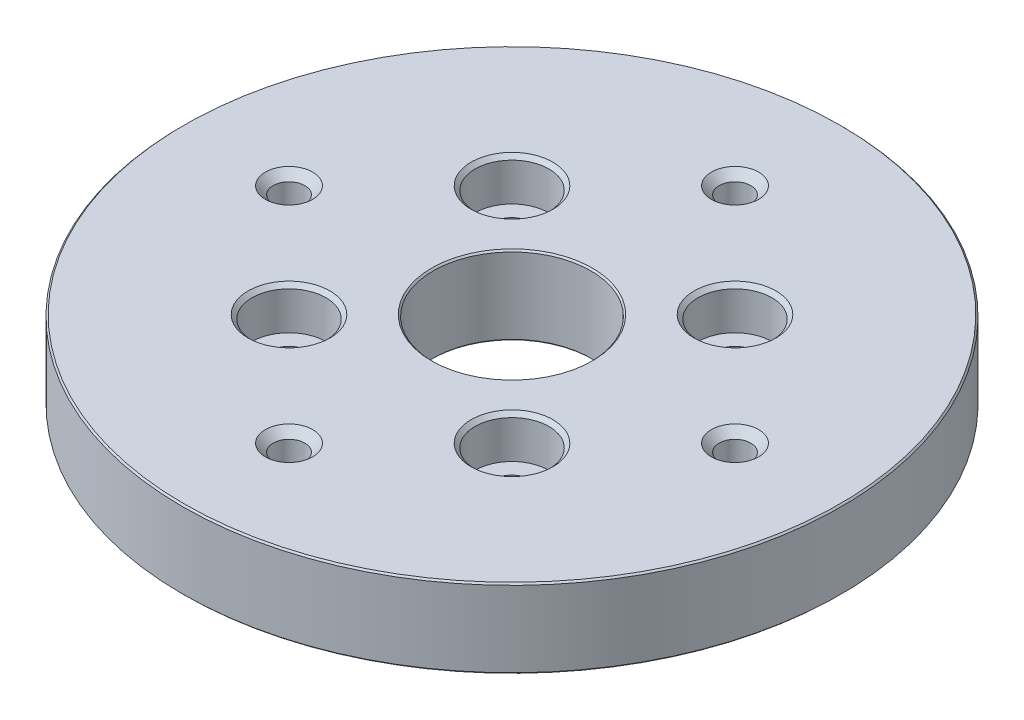
ISO-10303-21;
HEADER;
FILE_DESCRIPTION(('STEP AP214'),'2;1');
FILE_NAME('part.step','',(''),(''),'','','');
FILE_SCHEMA(('AUTOMOTIVE_DESIGN { 1 0 10303 214 1 1 1 1 }'));
ENDSEC;
DATA;
#1=APPLICATION_CONTEXT('core data for automotive mechanical design processes');
#2=APPLICATION_PROTOCOL_DEFINITION('international standard','automotive_design',2000,#1);
#3=PRODUCT_CONTEXT('',#1,'mechanical');
#4=PRODUCT('Part','Part','',(#3));
#5=PRODUCT_RELATED_PRODUCT_CATEGORY('part','',(#4));
#6=PRODUCT_DEFINITION_FORMATION('','',#4);
#7=PRODUCT_DEFINITION_CONTEXT('part definition',#1,'design');
#8=PRODUCT_DEFINITION('design','',#6,#7);
#9=PRODUCT_DEFINITION_SHAPE('','',#8);
#10=(LENGTH_UNIT() NAMED_UNIT(*) SI_UNIT(.MILLI.,.METRE.));
#11=(NAMED_UNIT(*) PLANE_ANGLE_UNIT() SI_UNIT($,.RADIAN.));
#12=(NAMED_UNIT(*) SI_UNIT($,.STERADIAN.) SOLID_ANGLE_UNIT());
#13=UNCERTAINTY_MEASURE_WITH_UNIT(LENGTH_MEASURE(1.E-05),#10,'distance_accuracy_value','');
#14=(GEOMETRIC_REPRESENTATION_CONTEXT(3) GLOBAL_UNCERTAINTY_ASSIGNED_CONTEXT((#13)) GLOBAL_UNIT_ASSIGNED_CONTEXT((#10,
#11,#12)) REPRESENTATION_CONTEXT('',''));
#15=CARTESIAN_POINT('',(0.,0.,0.));
#16=DIRECTION('',(0.,0.,1.));
#17=DIRECTION('',(1.,0.,0.));
#18=AXIS2_PLACEMENT_3D('',#15,#16,#17);
#19=CARTESIAN_POINT('',(0.,-12.7,0.));
#20=DIRECTION('',(0.,1.,0.));
#21=DIRECTION('',(0.,0.,1.));
#22=AXIS2_PLACEMENT_3D('',#19,#20,#21);
#23=CYLINDRICAL_SURFACE('',#22,53.086);
#24=CARTESIAN_POINT('',(0.,-12.446,0.));
#25=DIRECTION('',(0.,1.,0.));
#26=DIRECTION('',(0.,0.,1.));
#27=AXIS2_PLACEMENT_3D('',#24,#25,#26);
#28=CIRCLE('',#27,53.086);
#29=CARTESIAN_POINT('',(0.,-12.446,53.086));
#30=VERTEX_POINT('',#29);
#31=EDGE_CURVE('E58',#30,#30,#28,.T.);
#32=ORIENTED_EDGE('',*,*,#31,.T.);
#33=EDGE_LOOP('',(#32));
#34=FACE_BOUND('',#33,.T.);
#35=CARTESIAN_POINT('',(0.,-0.253999999999983,0.));
#36=DIRECTION('',(0.,1.,0.));
#37=DIRECTION('',(0.,0.,1.));
#38=AXIS2_PLACEMENT_3D('',#35,#36,#37);
#39=CIRCLE('',#38,53.086);
#40=CARTESIAN_POINT('',(0.,-0.253999999999983,53.086));
#41=VERTEX_POINT('',#40);
#42=EDGE_CURVE('E61',#41,#41,#39,.F.);
#43=ORIENTED_EDGE('',*,*,#42,.T.);
#44=EDGE_LOOP('',(#43));
#45=FACE_BOUND('',#44,.T.);
#46=ADVANCED_FACE('F32',(#34,#45),#23,.T.);
#47=CARTESIAN_POINT('',(0.,-12.7,0.));
#48=DIRECTION('',(0.,1.,0.));
#49=DIRECTION('',(0.,0.,1.));
#50=AXIS2_PLACEMENT_3D('',#47,#48,#49);
#51=PLANE('',#50);
#52=CARTESIAN_POINT('',(0.,-12.7,0.));
#53=DIRECTION('',(0.,1.,0.));
#54=DIRECTION('',(0.,0.,1.));
#55=AXIS2_PLACEMENT_3D('',#52,#53,#54);
#56=CIRCLE('',#55,52.832);
#57=CARTESIAN_POINT('',(0.,-12.7,52.832));
#58=VERTEX_POINT('',#57);
#59=EDGE_CURVE('E52',#58,#58,#56,.F.);
#60=ORIENTED_EDGE('',*,*,#59,.T.);
#61=EDGE_LOOP('',(#60));
#62=FACE_BOUND('',#61,.T.);
#63=CARTESIAN_POINT('',(0.,-12.7,0.));
#64=DIRECTION('',(0.,1.,0.));
#65=DIRECTION('',(0.,0.,1.));
#66=AXIS2_PLACEMENT_3D('',#63,#64,#65);
#67=CIRCLE('',#66,12.954);
#68=CARTESIAN_POINT('',(0.,-12.7,12.954));
#69=VERTEX_POINT('',#68);
#70=EDGE_CURVE('E55',#69,#69,#67,.T.);
#71=ORIENTED_EDGE('',*,*,#70,.T.);
#72=EDGE_LOOP('',(#71));
#73=FACE_BOUND('',#72,.T.);
#74=CARTESIAN_POINT('',(-17.9605122421383,-12.7,17.9605122421383));
#75=DIRECTION('',(0.,1.,0.));
#76=DIRECTION('',(0.,0.,1.));
#77=AXIS2_PLACEMENT_3D('',#74,#75,#76);
#78=CIRCLE('',#77,3.8989);
#79=CARTESIAN_POINT('',(-17.9605122421383,-12.7,21.8594122421383));
#80=VERTEX_POINT('',#79);
#81=EDGE_CURVE('E181',#80,#80,#78,.T.);
#82=ORIENTED_EDGE('',*,*,#81,.T.);
#83=EDGE_LOOP('',(#82));
#84=FACE_BOUND('',#83,.T.);
#85=CARTESIAN_POINT('',(-17.9605122421383,-12.7,-17.9605122421383));
#86=DIRECTION('',(0.,1.,0.));
#87=DIRECTION('',(0.,0.,1.));
#88=AXIS2_PLACEMENT_3D('',#85,#86,#87);
#89=CIRCLE('',#88,3.8989);
#90=CARTESIAN_POINT('',(-17.9605122421383,-12.7,-14.0616122421383));
#91=VERTEX_POINT('',#90);
#92=EDGE_CURVE('E163',#91,#91,#89,.T.);
#93=ORIENTED_EDGE('',*,*,#92,.T.);
#94=EDGE_LOOP('',(#93));
#95=FACE_BOUND('',#94,.T.);
#96=CARTESIAN_POINT('',(17.9605122421383,-12.7,-17.9605122421383));
#97=DIRECTION('',(0.,1.,0.));
#98=DIRECTION('',(0.,0.,1.));
#99=AXIS2_PLACEMENT_3D('',#96,#97,#98);
#100=CIRCLE('',#99,3.8989);
#101=CARTESIAN_POINT('',(17.9605122421383,-12.7,-14.0616122421383));
#102=VERTEX_POINT('',#101);
#103=EDGE_CURVE('E145',#102,#102,#100,.T.);
#104=ORIENTED_EDGE('',*,*,#103,.T.);
#105=EDGE_LOOP('',(#104));
#106=FACE_BOUND('',#105,.T.);
#107=CARTESIAN_POINT('',(17.9605122421383,-12.7,17.9605122421383));
#108=DIRECTION('',(0.,1.,0.));
#109=DIRECTION('',(0.,0.,1.));
#110=AXIS2_PLACEMENT_3D('',#107,#108,#109);
#111=CIRCLE('',#110,3.8989);
#112=CARTESIAN_POINT('',(17.9605122421383,-12.7,21.8594122421383));
#113=VERTEX_POINT('',#112);
#114=EDGE_CURVE('E127',#113,#113,#111,.T.);
#115=ORIENTED_EDGE('',*,*,#114,.T.);
#116=EDGE_LOOP('',(#115));
#117=FACE_BOUND('',#116,.T.);
#118=CARTESIAN_POINT('',(0.,-12.7,35.9210244842766));
#119=DIRECTION('',(0.,1.,0.));
#120=DIRECTION('',(0.,0.,1.));
#121=AXIS2_PLACEMENT_3D('',#118,#119,#120);
#122=CIRCLE('',#121,3.81);
#123=CARTESIAN_POINT('',(0.,-12.7,39.7310244842766));
#124=VERTEX_POINT('',#123);
#125=EDGE_CURVE('E109',#124,#124,#122,.T.);
#126=ORIENTED_EDGE('',*,*,#125,.T.);
#127=EDGE_LOOP('',(#126));
#128=FACE_BOUND('',#127,.T.);
#129=CARTESIAN_POINT('',(-35.9210244842766,-12.7,0.));
#130=DIRECTION('',(0.,1.,0.));
#131=DIRECTION('',(0.,0.,1.));
#132=AXIS2_PLACEMENT_3D('',#129,#130,#131);
#133=CIRCLE('',#132,3.80999999999999);
#134=CARTESIAN_POINT('',(-35.9210244842766,-12.7,3.80999999999999));
#135=VERTEX_POINT('',#134);
#136=EDGE_CURVE('E97',#135,#135,#133,.T.);
#137=ORIENTED_EDGE('',*,*,#136,.T.);
#138=EDGE_LOOP('',(#137));
#139=FACE_BOUND('',#138,.T.);
#140=CARTESIAN_POINT('',(0.,-12.7,-35.9210244842766));
#141=DIRECTION('',(0.,1.,0.));
#142=DIRECTION('',(0.,0.,1.));
#143=AXIS2_PLACEMENT_3D('',#140,#141,#142);
#144=CIRCLE('',#143,3.81);
#145=CARTESIAN_POINT('',(0.,-12.7,-32.1110244842766));
#146=VERTEX_POINT('',#145);
#147=EDGE_CURVE('E85',#146,#146,#144,.T.);
#148=ORIENTED_EDGE('',*,*,#147,.T.);
#149=EDGE_LOOP('',(#148));
#150=FACE_BOUND('',#149,.T.);
#151=CARTESIAN_POINT('',(35.9210244842766,-12.7,0.));
#152=DIRECTION('',(0.,1.,0.));
#153=DIRECTION('',(0.,0.,1.));
#154=AXIS2_PLACEMENT_3D('',#151,#152,#153);
#155=CIRCLE('',#154,3.80999999999999);
#156=CARTESIAN_POINT('',(35.9210244842766,-12.7,3.80999999999999));
#157=VERTEX_POINT('',#156);
#158=EDGE_CURVE('E73',#157,#157,#155,.T.);
#159=ORIENTED_EDGE('',*,*,#158,.T.);
#160=EDGE_LOOP('',(#159));
#161=FACE_BOUND('',#160,.T.);
#162=ADVANCED_FACE('F185',(#62,#73,#84,#95,#106,#117,#128,#139,#150,#161),#51,.F.);
#163=CARTESIAN_POINT('',(0.,0.,0.));
#164=DIRECTION('',(0.,1.,0.));
#165=DIRECTION('',(0.,0.,1.));
#166=AXIS2_PLACEMENT_3D('',#163,#164,#165);
#167=PLANE('',#166);
#168=CARTESIAN_POINT('',(0.,0.,0.));
#169=DIRECTION('',(0.,1.,0.));
#170=DIRECTION('',(0.,0.,1.));
#171=AXIS2_PLACEMENT_3D('',#168,#169,#170);
#172=CIRCLE('',#171,52.832);
#173=CARTESIAN_POINT('',(0.,0.,52.832));
#174=VERTEX_POINT('',#173);
#175=EDGE_CURVE('E43',#174,#174,#172,.T.);
#176=ORIENTED_EDGE('',*,*,#175,.T.);
#177=EDGE_LOOP('',(#176));
#178=FACE_BOUND('',#177,.T.);
#179=CARTESIAN_POINT('',(0.,0.,0.));
#180=DIRECTION('',(0.,1.,0.));
#181=DIRECTION('',(0.,0.,1.));
#182=AXIS2_PLACEMENT_3D('',#179,#180,#181);
#183=CIRCLE('',#182,12.954);
#184=CARTESIAN_POINT('',(0.,0.,12.954));
#185=VERTEX_POINT('',#184);
#186=EDGE_CURVE('E47',#185,#185,#183,.F.);
#187=ORIENTED_EDGE('',*,*,#186,.T.);
#188=EDGE_LOOP('',(#187));
#189=FACE_BOUND('',#188,.T.);
#190=CARTESIAN_POINT('',(-17.9605122421383,0.,17.9605122421383));
#191=DIRECTION('',(0.,1.,0.));
#192=DIRECTION('',(0.,0.,1.));
#193=AXIS2_PLACEMENT_3D('',#190,#191,#192);
#194=CIRCLE('',#193,6.58876);
#195=CARTESIAN_POINT('',(-17.9605122421383,0.,24.5492722421383));
#196=VERTEX_POINT('',#195);
#197=EDGE_CURVE('E178',#196,#196,#194,.T.);
#198=ORIENTED_EDGE('',*,*,#197,.F.);
#199=EDGE_LOOP('',(#198));
#200=FACE_BOUND('',#199,.T.);
#201=CARTESIAN_POINT('',(-17.9605122421383,0.,-17.9605122421383));
#202=DIRECTION('',(0.,1.,0.));
#203=DIRECTION('',(0.,0.,1.));
#204=AXIS2_PLACEMENT_3D('',#201,#202,#203);
#205=CIRCLE('',#204,6.58876);
#206=CARTESIAN_POINT('',(-17.9605122421383,0.,-11.3717522421383));
#207=VERTEX_POINT('',#206);
#208=EDGE_CURVE('E160',#207,#207,#205,.T.);
#209=ORIENTED_EDGE('',*,*,#208,.F.);
#210=EDGE_LOOP('',(#209));
#211=FACE_BOUND('',#210,.T.);
#212=CARTESIAN_POINT('',(17.9605122421383,0.,-17.9605122421383));
#213=DIRECTION('',(0.,1.,0.));
#214=DIRECTION('',(0.,0.,1.));
#215=AXIS2_PLACEMENT_3D('',#212,#213,#214);
#216=CIRCLE('',#215,6.58876);
#217=CARTESIAN_POINT('',(17.9605122421383,0.,-11.3717522421383));
#218=VERTEX_POINT('',#217);
#219=EDGE_CURVE('E142',#218,#218,#216,.T.);
#220=ORIENTED_EDGE('',*,*,#219,.F.);
#221=EDGE_LOOP('',(#220));
#222=FACE_BOUND('',#221,.T.);
#223=CARTESIAN_POINT('',(17.9605122421383,0.,17.9605122421383));
#224=DIRECTION('',(0.,1.,0.));
#225=DIRECTION('',(0.,0.,1.));
#226=AXIS2_PLACEMENT_3D('',#223,#224,#225);
#227=CIRCLE('',#226,6.58876);
#228=CARTESIAN_POINT('',(17.9605122421383,0.,24.5492722421383));
#229=VERTEX_POINT('',#228);
#230=EDGE_CURVE('E124',#229,#229,#227,.T.);
#231=ORIENTED_EDGE('',*,*,#230,.F.);
#232=EDGE_LOOP('',(#231));
#233=FACE_BOUND('',#232,.T.);
#234=CARTESIAN_POINT('',(0.,0.,35.9210244842766));
#235=DIRECTION('',(0.,1.,0.));
#236=DIRECTION('',(0.,0.,1.));
#237=AXIS2_PLACEMENT_3D('',#234,#235,#236);
#238=CIRCLE('',#237,3.81);
#239=CARTESIAN_POINT('',(0.,0.,39.7310244842766));
#240=VERTEX_POINT('',#239);
#241=EDGE_CURVE('E106',#240,#240,#238,.T.);
#242=ORIENTED_EDGE('',*,*,#241,.F.);
#243=EDGE_LOOP('',(#242));
#244=FACE_BOUND('',#243,.T.);
#245=CARTESIAN_POINT('',(-35.9210244842766,0.,0.));
#246=DIRECTION('',(0.,1.,0.));
#247=DIRECTION('',(0.,0.,1.));
#248=AXIS2_PLACEMENT_3D('',#245,#246,#247);
#249=CIRCLE('',#248,3.81);
#250=CARTESIAN_POINT('',(-35.9210244842766,0.,3.81));
#251=VERTEX_POINT('',#250);
#252=EDGE_CURVE('E94',#251,#251,#249,.T.);
#253=ORIENTED_EDGE('',*,*,#252,.F.);
#254=EDGE_LOOP('',(#253));
#255=FACE_BOUND('',#254,.T.);
#256=CARTESIAN_POINT('',(0.,0.,-35.9210244842766));
#257=DIRECTION('',(0.,1.,0.));
#258=DIRECTION('',(0.,0.,1.));
#259=AXIS2_PLACEMENT_3D('',#256,#257,#258);
#260=CIRCLE('',#259,3.81);
#261=CARTESIAN_POINT('',(0.,0.,-32.1110244842766));
#262=VERTEX_POINT('',#261);
#263=EDGE_CURVE('E82',#262,#262,#260,.T.);
#264=ORIENTED_EDGE('',*,*,#263,.F.);
#265=EDGE_LOOP('',(#264));
#266=FACE_BOUND('',#265,.T.);
#267=CARTESIAN_POINT('',(35.9210244842766,0.,0.));
#268=DIRECTION('',(0.,1.,0.));
#269=DIRECTION('',(0.,0.,1.));
#270=AXIS2_PLACEMENT_3D('',#267,#268,#269);
#271=CIRCLE('',#270,3.81);
#272=CARTESIAN_POINT('',(35.9210244842766,0.,3.81));
#273=VERTEX_POINT('',#272);
#274=EDGE_CURVE('E70',#273,#273,#271,.T.);
#275=ORIENTED_EDGE('',*,*,#274,.F.);
#276=EDGE_LOOP('',(#275));
#277=FACE_BOUND('',#276,.T.);
#278=ADVANCED_FACE('F220',(#178,#189,#200,#211,#222,#233,#244,#255,#266,#277),#167,.T.);
#279=CARTESIAN_POINT('',(0.,-12.7,0.));
#280=DIRECTION('',(0.,1.,0.));
#281=DIRECTION('',(0.,0.,1.));
#282=AXIS2_PLACEMENT_3D('',#279,#280,#281);
#283=CYLINDRICAL_SURFACE('',#282,12.7);
#284=CARTESIAN_POINT('',(0.,-12.446,0.));
#285=DIRECTION('',(0.,1.,0.));
#286=DIRECTION('',(0.,0.,1.));
#287=AXIS2_PLACEMENT_3D('',#284,#285,#286);
#288=CIRCLE('',#287,12.7);
#289=CARTESIAN_POINT('',(0.,-12.446,12.7));
#290=VERTEX_POINT('',#289);
#291=EDGE_CURVE('E10',#290,#290,#288,.F.);
#292=ORIENTED_EDGE('',*,*,#291,.T.);
#293=EDGE_LOOP('',(#292));
#294=FACE_BOUND('',#293,.T.);
#295=CARTESIAN_POINT('',(0.,-0.253999999999997,0.));
#296=DIRECTION('',(0.,1.,0.));
#297=DIRECTION('',(0.,0.,1.));
#298=AXIS2_PLACEMENT_3D('',#295,#296,#297);
#299=CIRCLE('',#298,12.7);
#300=CARTESIAN_POINT('',(0.,-0.253999999999997,12.7));
#301=VERTEX_POINT('',#300);
#302=EDGE_CURVE('E39',#301,#301,#299,.T.);
#303=ORIENTED_EDGE('',*,*,#302,.T.);
#304=EDGE_LOOP('',(#303));
#305=FACE_BOUND('',#304,.T.);
#306=ADVANCED_FACE('F223',(#294,#305),#283,.F.);
#307=CARTESIAN_POINT('',(35.9210244842766,-11.4427,0.));
#308=DIRECTION('',(0.,-1.,0.));
#309=DIRECTION('',(0.,0.,-1.));
#310=AXIS2_PLACEMENT_3D('',#307,#308,#309);
#311=CONICAL_SURFACE('',#310,2.5527,0.785398163397446);
#312=ORIENTED_EDGE('',*,*,#158,.F.);
#313=EDGE_LOOP('',(#312));
#314=FACE_BOUND('',#313,.T.);
#315=CARTESIAN_POINT('',(35.9210244842766,-11.4427,0.));
#316=DIRECTION('',(0.,1.,0.));
#317=DIRECTION('',(0.,0.,1.));
#318=AXIS2_PLACEMENT_3D('',#315,#316,#317);
#319=CIRCLE('',#318,2.5527);
#320=CARTESIAN_POINT('',(35.9210244842766,-11.4427,2.55269999999999));
#321=VERTEX_POINT('',#320);
#322=EDGE_CURVE('E64',#321,#321,#319,.T.);
#323=ORIENTED_EDGE('',*,*,#322,.T.);
#324=EDGE_LOOP('',(#323));
#325=FACE_BOUND('',#324,.T.);
#326=ADVANCED_FACE('F253',(#314,#325),#311,.F.);
#327=CARTESIAN_POINT('',(35.9210244842766,0.,0.));
#328=DIRECTION('',(0.,1.,0.));
#329=DIRECTION('',(0.,0.,1.));
#330=AXIS2_PLACEMENT_3D('',#327,#328,#329);
#331=CYLINDRICAL_SURFACE('',#330,2.5527);
#332=ORIENTED_EDGE('',*,*,#322,.F.);
#333=EDGE_LOOP('',(#332));
#334=FACE_BOUND('',#333,.T.);
#335=CARTESIAN_POINT('',(35.9210244842766,-1.2573,0.));
#336=DIRECTION('',(0.,1.,0.));
#337=DIRECTION('',(0.,0.,1.));
#338=AXIS2_PLACEMENT_3D('',#335,#336,#337);
#339=CIRCLE('',#338,2.5527);
#340=CARTESIAN_POINT('',(35.9210244842766,-1.2573,2.55269999999999));
#341=VERTEX_POINT('',#340);
#342=EDGE_CURVE('E67',#341,#341,#339,.T.);
#343=ORIENTED_EDGE('',*,*,#342,.T.);
#344=EDGE_LOOP('',(#343));
#345=FACE_BOUND('',#344,.T.);
#346=ADVANCED_FACE('F243',(#334,#345),#331,.F.);
#347=CARTESIAN_POINT('',(35.9210244842766,0.,0.));
#348=DIRECTION('',(0.,1.,0.));
#349=DIRECTION('',(0.,0.,1.));
#350=AXIS2_PLACEMENT_3D('',#347,#348,#349);
#351=CONICAL_SURFACE('',#350,3.81,0.785398163397448);
#352=ORIENTED_EDGE('',*,*,#342,.F.);
#353=EDGE_LOOP('',(#352));
#354=FACE_BOUND('',#353,.T.);
#355=ORIENTED_EDGE('',*,*,#274,.T.);
#356=EDGE_LOOP('',(#355));
#357=FACE_BOUND('',#356,.T.);
#358=ADVANCED_FACE('F240',(#354,#357),#351,.F.);
#359=CARTESIAN_POINT('',(0.,-11.4427,-35.9210244842766));
#360=DIRECTION('',(0.,-1.,0.));
#361=DIRECTION('',(0.,0.,-1.));
#362=AXIS2_PLACEMENT_3D('',#359,#360,#361);
#363=CONICAL_SURFACE('',#362,2.5527,0.785398163397447);
#364=ORIENTED_EDGE('',*,*,#147,.F.);
#365=EDGE_LOOP('',(#364));
#366=FACE_BOUND('',#365,.T.);
#367=CARTESIAN_POINT('',(0.,-11.4427,-35.9210244842766));
#368=DIRECTION('',(0.,1.,0.));
#369=DIRECTION('',(0.,0.,1.));
#370=AXIS2_PLACEMENT_3D('',#367,#368,#369);
#371=CIRCLE('',#370,2.5527);
#372=CARTESIAN_POINT('',(0.,-11.4427,-33.3683244842766));
#373=VERTEX_POINT('',#372);
#374=EDGE_CURVE('E76',#373,#373,#371,.T.);
#375=ORIENTED_EDGE('',*,*,#374,.T.);
#376=EDGE_LOOP('',(#375));
#377=FACE_BOUND('',#376,.T.);
#378=ADVANCED_FACE('F242',(#366,#377),#363,.F.);
#379=CARTESIAN_POINT('',(0.,0.,-35.9210244842766));
#380=DIRECTION('',(0.,1.,0.));
#381=DIRECTION('',(0.,0.,1.));
#382=AXIS2_PLACEMENT_3D('',#379,#380,#381);
#383=CYLINDRICAL_SURFACE('',#382,2.5527);
#384=ORIENTED_EDGE('',*,*,#374,.F.);
#385=EDGE_LOOP('',(#384));
#386=FACE_BOUND('',#385,.T.);
#387=CARTESIAN_POINT('',(0.,-1.2573,-35.9210244842766));
#388=DIRECTION('',(0.,1.,0.));
#389=DIRECTION('',(0.,0.,1.));
#390=AXIS2_PLACEMENT_3D('',#387,#388,#389);
#391=CIRCLE('',#390,2.5527);
#392=CARTESIAN_POINT('',(0.,-1.2573,-33.3683244842766));
#393=VERTEX_POINT('',#392);
#394=EDGE_CURVE('E79',#393,#393,#391,.T.);
#395=ORIENTED_EDGE('',*,*,#394,.T.);
#396=EDGE_LOOP('',(#395));
#397=FACE_BOUND('',#396,.T.);
#398=ADVANCED_FACE('F250',(#386,#397),#383,.F.);
#399=CARTESIAN_POINT('',(0.,0.,-35.9210244842766));
#400=DIRECTION('',(0.,1.,0.));
#401=DIRECTION('',(0.,0.,1.));
#402=AXIS2_PLACEMENT_3D('',#399,#400,#401);
#403=CONICAL_SURFACE('',#402,3.81,0.785398163397447);
#404=ORIENTED_EDGE('',*,*,#394,.F.);
#405=EDGE_LOOP('',(#404));
#406=FACE_BOUND('',#405,.T.);
#407=ORIENTED_EDGE('',*,*,#263,.T.);
#408=EDGE_LOOP('',(#407));
#409=FACE_BOUND('',#408,.T.);
#410=ADVANCED_FACE('F572',(#406,#409),#403,.F.);
#411=CARTESIAN_POINT('',(-35.9210244842766,-11.4427,0.));
#412=DIRECTION('',(0.,-1.,0.));
#413=DIRECTION('',(0.,0.,-1.));
#414=AXIS2_PLACEMENT_3D('',#411,#412,#413);
#415=CONICAL_SURFACE('',#414,2.5527,0.785398163397446);
#416=ORIENTED_EDGE('',*,*,#136,.F.);
#417=EDGE_LOOP('',(#416));
#418=FACE_BOUND('',#417,.T.);
#419=CARTESIAN_POINT('',(-35.9210244842766,-11.4427,0.));
#420=DIRECTION('',(0.,1.,0.));
#421=DIRECTION('',(0.,0.,1.));
#422=AXIS2_PLACEMENT_3D('',#419,#420,#421);
#423=CIRCLE('',#422,2.5527);
#424=CARTESIAN_POINT('',(-35.9210244842766,-11.4427,2.55269999999999));
#425=VERTEX_POINT('',#424);
#426=EDGE_CURVE('E88',#425,#425,#423,.T.);
#427=ORIENTED_EDGE('',*,*,#426,.T.);
#428=EDGE_LOOP('',(#427));
#429=FACE_BOUND('',#428,.T.);
#430=ADVANCED_FACE('F561',(#418,#429),#415,.F.);
#431=CARTESIAN_POINT('',(-35.9210244842766,0.,0.));
#432=DIRECTION('',(0.,1.,0.));
#433=DIRECTION('',(0.,0.,1.));
#434=AXIS2_PLACEMENT_3D('',#431,#432,#433);
#435=CYLINDRICAL_SURFACE('',#434,2.5527);
#436=ORIENTED_EDGE('',*,*,#426,.F.);
#437=EDGE_LOOP('',(#436));
#438=FACE_BOUND('',#437,.T.);
#439=CARTESIAN_POINT('',(-35.9210244842766,-1.2573,0.));
#440=DIRECTION('',(0.,1.,0.));
#441=DIRECTION('',(0.,0.,1.));
#442=AXIS2_PLACEMENT_3D('',#439,#440,#441);
#443=CIRCLE('',#442,2.5527);
#444=CARTESIAN_POINT('',(-35.9210244842766,-1.2573,2.55269999999999));
#445=VERTEX_POINT('',#444);
#446=EDGE_CURVE('E91',#445,#445,#443,.T.);
#447=ORIENTED_EDGE('',*,*,#446,.T.);
#448=EDGE_LOOP('',(#447));
#449=FACE_BOUND('',#448,.T.);
#450=ADVANCED_FACE('F551',(#438,#449),#435,.F.);
#451=CARTESIAN_POINT('',(-35.9210244842766,0.,0.));
#452=DIRECTION('',(0.,1.,0.));
#453=DIRECTION('',(0.,0.,1.));
#454=AXIS2_PLACEMENT_3D('',#451,#452,#453);
#455=CONICAL_SURFACE('',#454,3.81,0.785398163397448);
#456=ORIENTED_EDGE('',*,*,#446,.F.);
#457=EDGE_LOOP('',(#456));
#458=FACE_BOUND('',#457,.T.);
#459=ORIENTED_EDGE('',*,*,#252,.T.);
#460=EDGE_LOOP('',(#459));
#461=FACE_BOUND('',#460,.T.);
#462=ADVANCED_FACE('F541',(#458,#461),#455,.F.);
#463=CARTESIAN_POINT('',(0.,-11.4427,35.9210244842766));
#464=DIRECTION('',(0.,-1.,0.));
#465=DIRECTION('',(0.,0.,-1.));
#466=AXIS2_PLACEMENT_3D('',#463,#464,#465);
#467=CONICAL_SURFACE('',#466,2.5527,0.785398163397447);
#468=ORIENTED_EDGE('',*,*,#125,.F.);
#469=EDGE_LOOP('',(#468));
#470=FACE_BOUND('',#469,.T.);
#471=CARTESIAN_POINT('',(0.,-11.4427,35.9210244842766));
#472=DIRECTION('',(0.,1.,0.));
#473=DIRECTION('',(0.,0.,1.));
#474=AXIS2_PLACEMENT_3D('',#471,#472,#473);
#475=CIRCLE('',#474,2.5527);
#476=CARTESIAN_POINT('',(0.,-11.4427,38.4737244842766));
#477=VERTEX_POINT('',#476);
#478=EDGE_CURVE('E100',#477,#477,#475,.T.);
#479=ORIENTED_EDGE('',*,*,#478,.T.);
#480=EDGE_LOOP('',(#479));
#481=FACE_BOUND('',#480,.T.);
#482=ADVANCED_FACE('F530',(#470,#481),#467,.F.);
#483=CARTESIAN_POINT('',(0.,0.,35.9210244842766));
#484=DIRECTION('',(0.,1.,0.));
#485=DIRECTION('',(0.,0.,1.));
#486=AXIS2_PLACEMENT_3D('',#483,#484,#485);
#487=CYLINDRICAL_SURFACE('',#486,2.5527);
#488=ORIENTED_EDGE('',*,*,#478,.F.);
#489=EDGE_LOOP('',(#488));
#490=FACE_BOUND('',#489,.T.);
#491=CARTESIAN_POINT('',(0.,-1.2573,35.9210244842766));
#492=DIRECTION('',(0.,1.,0.));
#493=DIRECTION('',(0.,0.,1.));
#494=AXIS2_PLACEMENT_3D('',#491,#492,#493);
#495=CIRCLE('',#494,2.5527);
#496=CARTESIAN_POINT('',(0.,-1.2573,38.4737244842766));
#497=VERTEX_POINT('',#496);
#498=EDGE_CURVE('E103',#497,#497,#495,.T.);
#499=ORIENTED_EDGE('',*,*,#498,.T.);
#500=EDGE_LOOP('',(#499));
#501=FACE_BOUND('',#500,.T.);
#502=ADVANCED_FACE('F519',(#490,#501),#487,.F.);
#503=CARTESIAN_POINT('',(0.,0.,35.9210244842766));
#504=DIRECTION('',(0.,1.,0.));
#505=DIRECTION('',(0.,0.,1.));
#506=AXIS2_PLACEMENT_3D('',#503,#504,#505);
#507=CONICAL_SURFACE('',#506,3.81,0.785398163397447);
#508=ORIENTED_EDGE('',*,*,#498,.F.);
#509=EDGE_LOOP('',(#508));
#510=FACE_BOUND('',#509,.T.);
#511=ORIENTED_EDGE('',*,*,#241,.T.);
#512=EDGE_LOOP('',(#511));
#513=FACE_BOUND('',#512,.T.);
#514=ADVANCED_FACE('F509',(#510,#513),#507,.F.);
#515=CARTESIAN_POINT('',(17.9605122421383,-12.065,17.9605122421383));
#516=DIRECTION('',(0.,-1.,0.));
#517=DIRECTION('',(0.,0.,-1.));
#518=AXIS2_PLACEMENT_3D('',#515,#516,#517);
#519=CONICAL_SURFACE('',#518,3.2639,0.785398163397447);
#520=ORIENTED_EDGE('',*,*,#114,.F.);
#521=EDGE_LOOP('',(#520));
#522=FACE_BOUND('',#521,.T.);
#523=CARTESIAN_POINT('',(17.9605122421383,-12.065,17.9605122421383));
#524=DIRECTION('',(0.,1.,0.));
#525=DIRECTION('',(0.,0.,1.));
#526=AXIS2_PLACEMENT_3D('',#523,#524,#525);
#527=CIRCLE('',#526,3.2639);
#528=CARTESIAN_POINT('',(17.9605122421383,-12.065,21.2244122421383));
#529=VERTEX_POINT('',#528);
#530=EDGE_CURVE('E112',#529,#529,#527,.T.);
#531=ORIENTED_EDGE('',*,*,#530,.T.);
#532=EDGE_LOOP('',(#531));
#533=FACE_BOUND('',#532,.T.);
#534=ADVANCED_FACE('F499',(#522,#533),#519,.F.);
#535=CARTESIAN_POINT('',(17.9605122421383,0.,17.9605122421383));
#536=DIRECTION('',(0.,1.,0.));
#537=DIRECTION('',(0.,0.,1.));
#538=AXIS2_PLACEMENT_3D('',#535,#536,#537);
#539=CYLINDRICAL_SURFACE('',#538,3.2639);
#540=ORIENTED_EDGE('',*,*,#530,.F.);
#541=EDGE_LOOP('',(#540));
#542=FACE_BOUND('',#541,.T.);
#543=CARTESIAN_POINT('',(17.9605122421383,-6.7564,17.9605122421383));
#544=DIRECTION('',(0.,1.,0.));
#545=DIRECTION('',(0.,0.,1.));
#546=AXIS2_PLACEMENT_3D('',#543,#544,#545);
#547=CIRCLE('',#546,3.2639);
#548=CARTESIAN_POINT('',(17.9605122421383,-6.7564,21.2244122421383));
#549=VERTEX_POINT('',#548);
#550=EDGE_CURVE('E115',#549,#549,#547,.T.);
#551=ORIENTED_EDGE('',*,*,#550,.T.);
#552=EDGE_LOOP('',(#551));
#553=FACE_BOUND('',#552,.T.);
#554=ADVANCED_FACE('F489',(#542,#553),#539,.F.);
#555=CARTESIAN_POINT('',(23.9142722421383,-6.7564,17.9605122421383));
#556=DIRECTION('',(0.,-1.,0.));
#557=DIRECTION('',(0.,0.,-1.));
#558=AXIS2_PLACEMENT_3D('',#555,#556,#557);
#559=PLANE('',#558);
#560=ORIENTED_EDGE('',*,*,#550,.F.);
#561=EDGE_LOOP('',(#560));
#562=FACE_BOUND('',#561,.T.);
#563=CARTESIAN_POINT('',(17.9605122421383,-6.7564,17.9605122421383));
#564=DIRECTION('',(0.,1.,0.));
#565=DIRECTION('',(0.,0.,1.));
#566=AXIS2_PLACEMENT_3D('',#563,#564,#565);
#567=CIRCLE('',#566,5.95376);
#568=CARTESIAN_POINT('',(17.9605122421383,-6.7564,23.9142722421383));
#569=VERTEX_POINT('',#568);
#570=EDGE_CURVE('E118',#569,#569,#567,.T.);
#571=ORIENTED_EDGE('',*,*,#570,.T.);
#572=EDGE_LOOP('',(#571));
#573=FACE_BOUND('',#572,.T.);
#574=ADVANCED_FACE('F479',(#562,#573),#559,.F.);
#575=CARTESIAN_POINT('',(17.9605122421383,0.,17.9605122421383));
#576=DIRECTION('',(0.,1.,0.));
#577=DIRECTION('',(0.,0.,1.));
#578=AXIS2_PLACEMENT_3D('',#575,#576,#577);
#579=CYLINDRICAL_SURFACE('',#578,5.95376);
#580=ORIENTED_EDGE('',*,*,#570,.F.);
#581=EDGE_LOOP('',(#580));
#582=FACE_BOUND('',#581,.T.);
#583=CARTESIAN_POINT('',(17.9605122421383,-0.635000000000002,17.9605122421383));
#584=DIRECTION('',(0.,1.,0.));
#585=DIRECTION('',(0.,0.,1.));
#586=AXIS2_PLACEMENT_3D('',#583,#584,#585);
#587=CIRCLE('',#586,5.95376);
#588=CARTESIAN_POINT('',(17.9605122421383,-0.635000000000002,23.9142722421383));
#589=VERTEX_POINT('',#588);
#590=EDGE_CURVE('E121',#589,#589,#587,.T.);
#591=ORIENTED_EDGE('',*,*,#590,.T.);
#592=EDGE_LOOP('',(#591));
#593=FACE_BOUND('',#592,.T.);
#594=ADVANCED_FACE('F469',(#582,#593),#579,.F.);
#595=CARTESIAN_POINT('',(17.9605122421383,0.,17.9605122421383));
#596=DIRECTION('',(0.,1.,0.));
#597=DIRECTION('',(0.,0.,1.));
#598=AXIS2_PLACEMENT_3D('',#595,#596,#597);
#599=CONICAL_SURFACE('',#598,6.58876,0.785398163397445);
#600=ORIENTED_EDGE('',*,*,#590,.F.);
#601=EDGE_LOOP('',(#600));
#602=FACE_BOUND('',#601,.T.);
#603=ORIENTED_EDGE('',*,*,#230,.T.);
#604=EDGE_LOOP('',(#603));
#605=FACE_BOUND('',#604,.T.);
#606=ADVANCED_FACE('F459',(#602,#605),#599,.F.);
#607=CARTESIAN_POINT('',(17.9605122421383,-12.065,-17.9605122421383));
#608=DIRECTION('',(0.,-1.,0.));
#609=DIRECTION('',(0.,0.,-1.));
#610=AXIS2_PLACEMENT_3D('',#607,#608,#609);
#611=CONICAL_SURFACE('',#610,3.2639,0.785398163397447);
#612=ORIENTED_EDGE('',*,*,#103,.F.);
#613=EDGE_LOOP('',(#612));
#614=FACE_BOUND('',#613,.T.);
#615=CARTESIAN_POINT('',(17.9605122421383,-12.065,-17.9605122421383));
#616=DIRECTION('',(0.,1.,0.));
#617=DIRECTION('',(0.,0.,1.));
#618=AXIS2_PLACEMENT_3D('',#615,#616,#617);
#619=CIRCLE('',#618,3.2639);
#620=CARTESIAN_POINT('',(17.9605122421383,-12.065,-14.6966122421383));
#621=VERTEX_POINT('',#620);
#622=EDGE_CURVE('E130',#621,#621,#619,.T.);
#623=ORIENTED_EDGE('',*,*,#622,.T.);
#624=EDGE_LOOP('',(#623));
#625=FACE_BOUND('',#624,.T.);
#626=ADVANCED_FACE('F449',(#614,#625),#611,.F.);
#627=CARTESIAN_POINT('',(17.9605122421383,0.,-17.9605122421383));
#628=DIRECTION('',(0.,1.,0.));
#629=DIRECTION('',(0.,0.,1.));
#630=AXIS2_PLACEMENT_3D('',#627,#628,#629);
#631=CYLINDRICAL_SURFACE('',#630,3.2639);
#632=ORIENTED_EDGE('',*,*,#622,.F.);
#633=EDGE_LOOP('',(#632));
#634=FACE_BOUND('',#633,.T.);
#635=CARTESIAN_POINT('',(17.9605122421383,-6.7564,-17.9605122421383));
#636=DIRECTION('',(0.,1.,0.));
#637=DIRECTION('',(0.,0.,1.));
#638=AXIS2_PLACEMENT_3D('',#635,#636,#637);
#639=CIRCLE('',#638,3.2639);
#640=CARTESIAN_POINT('',(17.9605122421383,-6.7564,-14.6966122421383));
#641=VERTEX_POINT('',#640);
#642=EDGE_CURVE('E133',#641,#641,#639,.T.);
#643=ORIENTED_EDGE('',*,*,#642,.T.);
#644=EDGE_LOOP('',(#643));
#645=FACE_BOUND('',#644,.T.);
#646=ADVANCED_FACE('F439',(#634,#645),#631,.F.);
#647=CARTESIAN_POINT('',(23.9142722421383,-6.7564,-17.9605122421383));
#648=DIRECTION('',(0.,-1.,0.));
#649=DIRECTION('',(0.,0.,-1.));
#650=AXIS2_PLACEMENT_3D('',#647,#648,#649);
#651=PLANE('',#650);
#652=ORIENTED_EDGE('',*,*,#642,.F.);
#653=EDGE_LOOP('',(#652));
#654=FACE_BOUND('',#653,.T.);
#655=CARTESIAN_POINT('',(17.9605122421383,-6.7564,-17.9605122421383));
#656=DIRECTION('',(0.,1.,0.));
#657=DIRECTION('',(0.,0.,1.));
#658=AXIS2_PLACEMENT_3D('',#655,#656,#657);
#659=CIRCLE('',#658,5.95376);
#660=CARTESIAN_POINT('',(17.9605122421383,-6.7564,-12.0067522421383));
#661=VERTEX_POINT('',#660);
#662=EDGE_CURVE('E136',#661,#661,#659,.T.);
#663=ORIENTED_EDGE('',*,*,#662,.T.);
#664=EDGE_LOOP('',(#663));
#665=FACE_BOUND('',#664,.T.);
#666=ADVANCED_FACE('F429',(#654,#665),#651,.F.);
#667=CARTESIAN_POINT('',(17.9605122421383,0.,-17.9605122421383));
#668=DIRECTION('',(0.,1.,0.));
#669=DIRECTION('',(0.,0.,1.));
#670=AXIS2_PLACEMENT_3D('',#667,#668,#669);
#671=CYLINDRICAL_SURFACE('',#670,5.95376);
#672=ORIENTED_EDGE('',*,*,#662,.F.);
#673=EDGE_LOOP('',(#672));
#674=FACE_BOUND('',#673,.T.);
#675=CARTESIAN_POINT('',(17.9605122421383,-0.635000000000002,-17.9605122421383));
#676=DIRECTION('',(0.,1.,0.));
#677=DIRECTION('',(0.,0.,1.));
#678=AXIS2_PLACEMENT_3D('',#675,#676,#677);
#679=CIRCLE('',#678,5.95376);
#680=CARTESIAN_POINT('',(17.9605122421383,-0.635000000000002,-12.0067522421383));
#681=VERTEX_POINT('',#680);
#682=EDGE_CURVE('E139',#681,#681,#679,.T.);
#683=ORIENTED_EDGE('',*,*,#682,.T.);
#684=EDGE_LOOP('',(#683));
#685=FACE_BOUND('',#684,.T.);
#686=ADVANCED_FACE('F419',(#674,#685),#671,.F.);
#687=CARTESIAN_POINT('',(17.9605122421383,0.,-17.9605122421383));
#688=DIRECTION('',(0.,1.,0.));
#689=DIRECTION('',(0.,0.,1.));
#690=AXIS2_PLACEMENT_3D('',#687,#688,#689);
#691=CONICAL_SURFACE('',#690,6.58876,0.785398163397445);
#692=ORIENTED_EDGE('',*,*,#682,.F.);
#693=EDGE_LOOP('',(#692));
#694=FACE_BOUND('',#693,.T.);
#695=ORIENTED_EDGE('',*,*,#219,.T.);
#696=EDGE_LOOP('',(#695));
#697=FACE_BOUND('',#696,.T.);
#698=ADVANCED_FACE('F409',(#694,#697),#691,.F.);
#699=CARTESIAN_POINT('',(-17.9605122421383,-12.065,-17.9605122421383));
#700=DIRECTION('',(0.,-1.,0.));
#701=DIRECTION('',(0.,0.,-1.));
#702=AXIS2_PLACEMENT_3D('',#699,#700,#701);
#703=CONICAL_SURFACE('',#702,3.2639,0.785398163397447);
#704=ORIENTED_EDGE('',*,*,#92,.F.);
#705=EDGE_LOOP('',(#704));
#706=FACE_BOUND('',#705,.T.);
#707=CARTESIAN_POINT('',(-17.9605122421383,-12.065,-17.9605122421383));
#708=DIRECTION('',(0.,1.,0.));
#709=DIRECTION('',(0.,0.,1.));
#710=AXIS2_PLACEMENT_3D('',#707,#708,#709);
#711=CIRCLE('',#710,3.2639);
#712=CARTESIAN_POINT('',(-17.9605122421383,-12.065,-14.6966122421383));
#713=VERTEX_POINT('',#712);
#714=EDGE_CURVE('E148',#713,#713,#711,.T.);
#715=ORIENTED_EDGE('',*,*,#714,.T.);
#716=EDGE_LOOP('',(#715));
#717=FACE_BOUND('',#716,.T.);
#718=ADVANCED_FACE('F399',(#706,#717),#703,.F.);
#719=CARTESIAN_POINT('',(-17.9605122421383,0.,-17.9605122421383));
#720=DIRECTION('',(0.,1.,0.));
#721=DIRECTION('',(0.,0.,1.));
#722=AXIS2_PLACEMENT_3D('',#719,#720,#721);
#723=CYLINDRICAL_SURFACE('',#722,3.2639);
#724=ORIENTED_EDGE('',*,*,#714,.F.);
#725=EDGE_LOOP('',(#724));
#726=FACE_BOUND('',#725,.T.);
#727=CARTESIAN_POINT('',(-17.9605122421383,-6.7564,-17.9605122421383));
#728=DIRECTION('',(0.,1.,0.));
#729=DIRECTION('',(0.,0.,1.));
#730=AXIS2_PLACEMENT_3D('',#727,#728,#729);
#731=CIRCLE('',#730,3.2639);
#732=CARTESIAN_POINT('',(-17.9605122421383,-6.7564,-14.6966122421383));
#733=VERTEX_POINT('',#732);
#734=EDGE_CURVE('E151',#733,#733,#731,.T.);
#735=ORIENTED_EDGE('',*,*,#734,.T.);
#736=EDGE_LOOP('',(#735));
#737=FACE_BOUND('',#736,.T.);
#738=ADVANCED_FACE('F389',(#726,#737),#723,.F.);
#739=CARTESIAN_POINT('',(-12.0067522421383,-6.7564,-17.9605122421383));
#740=DIRECTION('',(0.,-1.,0.));
#741=DIRECTION('',(0.,0.,-1.));
#742=AXIS2_PLACEMENT_3D('',#739,#740,#741);
#743=PLANE('',#742);
#744=ORIENTED_EDGE('',*,*,#734,.F.);
#745=EDGE_LOOP('',(#744));
#746=FACE_BOUND('',#745,.T.);
#747=CARTESIAN_POINT('',(-17.9605122421383,-6.7564,-17.9605122421383));
#748=DIRECTION('',(0.,1.,0.));
#749=DIRECTION('',(0.,0.,1.));
#750=AXIS2_PLACEMENT_3D('',#747,#748,#749);
#751=CIRCLE('',#750,5.95376);
#752=CARTESIAN_POINT('',(-17.9605122421383,-6.7564,-12.0067522421383));
#753=VERTEX_POINT('',#752);
#754=EDGE_CURVE('E154',#753,#753,#751,.T.);
#755=ORIENTED_EDGE('',*,*,#754,.T.);
#756=EDGE_LOOP('',(#755));
#757=FACE_BOUND('',#756,.T.);
#758=ADVANCED_FACE('F379',(#746,#757),#743,.F.);
#759=CARTESIAN_POINT('',(-17.9605122421383,0.,-17.9605122421383));
#760=DIRECTION('',(0.,1.,0.));
#761=DIRECTION('',(0.,0.,1.));
#762=AXIS2_PLACEMENT_3D('',#759,#760,#761);
#763=CYLINDRICAL_SURFACE('',#762,5.95376);
#764=ORIENTED_EDGE('',*,*,#754,.F.);
#765=EDGE_LOOP('',(#764));
#766=FACE_BOUND('',#765,.T.);
#767=CARTESIAN_POINT('',(-17.9605122421383,-0.635000000000002,-17.9605122421383));
#768=DIRECTION('',(0.,1.,0.));
#769=DIRECTION('',(0.,0.,1.));
#770=AXIS2_PLACEMENT_3D('',#767,#768,#769);
#771=CIRCLE('',#770,5.95376);
#772=CARTESIAN_POINT('',(-17.9605122421383,-0.635000000000002,-12.0067522421383));
#773=VERTEX_POINT('',#772);
#774=EDGE_CURVE('E157',#773,#773,#771,.T.);
#775=ORIENTED_EDGE('',*,*,#774,.T.);
#776=EDGE_LOOP('',(#775));
#777=FACE_BOUND('',#776,.T.);
#778=ADVANCED_FACE('F369',(#766,#777),#763,.F.);
#779=CARTESIAN_POINT('',(-17.9605122421383,0.,-17.9605122421383));
#780=DIRECTION('',(0.,1.,0.));
#781=DIRECTION('',(0.,0.,1.));
#782=AXIS2_PLACEMENT_3D('',#779,#780,#781);
#783=CONICAL_SURFACE('',#782,6.58876,0.785398163397445);
#784=ORIENTED_EDGE('',*,*,#774,.F.);
#785=EDGE_LOOP('',(#784));
#786=FACE_BOUND('',#785,.T.);
#787=ORIENTED_EDGE('',*,*,#208,.T.);
#788=EDGE_LOOP('',(#787));
#789=FACE_BOUND('',#788,.T.);
#790=ADVANCED_FACE('F192',(#786,#789),#783,.F.);
#791=CARTESIAN_POINT('',(-17.9605122421383,-12.065,17.9605122421383));
#792=DIRECTION('',(0.,-1.,0.));
#793=DIRECTION('',(0.,0.,-1.));
#794=AXIS2_PLACEMENT_3D('',#791,#792,#793);
#795=CONICAL_SURFACE('',#794,3.2639,0.785398163397447);
#796=ORIENTED_EDGE('',*,*,#81,.F.);
#797=EDGE_LOOP('',(#796));
#798=FACE_BOUND('',#797,.T.);
#799=CARTESIAN_POINT('',(-17.9605122421383,-12.065,17.9605122421383));
#800=DIRECTION('',(0.,1.,0.));
#801=DIRECTION('',(0.,0.,1.));
#802=AXIS2_PLACEMENT_3D('',#799,#800,#801);
#803=CIRCLE('',#802,3.2639);
#804=CARTESIAN_POINT('',(-17.9605122421383,-12.065,21.2244122421383));
#805=VERTEX_POINT('',#804);
#806=EDGE_CURVE('E166',#805,#805,#803,.T.);
#807=ORIENTED_EDGE('',*,*,#806,.T.);
#808=EDGE_LOOP('',(#807));
#809=FACE_BOUND('',#808,.T.);
#810=ADVANCED_FACE('F188',(#798,#809),#795,.F.);
#811=CARTESIAN_POINT('',(-17.9605122421383,0.,17.9605122421383));
#812=DIRECTION('',(0.,1.,0.));
#813=DIRECTION('',(0.,0.,1.));
#814=AXIS2_PLACEMENT_3D('',#811,#812,#813);
#815=CYLINDRICAL_SURFACE('',#814,3.2639);
#816=ORIENTED_EDGE('',*,*,#806,.F.);
#817=EDGE_LOOP('',(#816));
#818=FACE_BOUND('',#817,.T.);
#819=CARTESIAN_POINT('',(-17.9605122421383,-6.7564,17.9605122421383));
#820=DIRECTION('',(0.,1.,0.));
#821=DIRECTION('',(0.,0.,1.));
#822=AXIS2_PLACEMENT_3D('',#819,#820,#821);
#823=CIRCLE('',#822,3.2639);
#824=CARTESIAN_POINT('',(-17.9605122421383,-6.7564,21.2244122421383));
#825=VERTEX_POINT('',#824);
#826=EDGE_CURVE('E169',#825,#825,#823,.T.);
#827=ORIENTED_EDGE('',*,*,#826,.T.);
#828=EDGE_LOOP('',(#827));
#829=FACE_BOUND('',#828,.T.);
#830=ADVANCED_FACE('F191',(#818,#829),#815,.F.);
#831=CARTESIAN_POINT('',(-12.0067522421383,-6.7564,17.9605122421383));
#832=DIRECTION('',(0.,-1.,0.));
#833=DIRECTION('',(0.,0.,-1.));
#834=AXIS2_PLACEMENT_3D('',#831,#832,#833);
#835=PLANE('',#834);
#836=ORIENTED_EDGE('',*,*,#826,.F.);
#837=EDGE_LOOP('',(#836));
#838=FACE_BOUND('',#837,.T.);
#839=CARTESIAN_POINT('',(-17.9605122421383,-6.7564,17.9605122421383));
#840=DIRECTION('',(0.,1.,0.));
#841=DIRECTION('',(0.,0.,1.));
#842=AXIS2_PLACEMENT_3D('',#839,#840,#841);
#843=CIRCLE('',#842,5.95376);
#844=CARTESIAN_POINT('',(-17.9605122421383,-6.7564,23.9142722421383));
#845=VERTEX_POINT('',#844);
#846=EDGE_CURVE('E172',#845,#845,#843,.T.);
#847=ORIENTED_EDGE('',*,*,#846,.T.);
#848=EDGE_LOOP('',(#847));
#849=FACE_BOUND('',#848,.T.);
#850=ADVANCED_FACE('F198',(#838,#849),#835,.F.);
#851=CARTESIAN_POINT('',(-17.9605122421383,0.,17.9605122421383));
#852=DIRECTION('',(0.,1.,0.));
#853=DIRECTION('',(0.,0.,1.));
#854=AXIS2_PLACEMENT_3D('',#851,#852,#853);
#855=CYLINDRICAL_SURFACE('',#854,5.95376);
#856=ORIENTED_EDGE('',*,*,#846,.F.);
#857=EDGE_LOOP('',(#856));
#858=FACE_BOUND('',#857,.T.);
#859=CARTESIAN_POINT('',(-17.9605122421383,-0.635000000000002,17.9605122421383));
#860=DIRECTION('',(0.,1.,0.));
#861=DIRECTION('',(0.,0.,1.));
#862=AXIS2_PLACEMENT_3D('',#859,#860,#861);
#863=CIRCLE('',#862,5.95376);
#864=CARTESIAN_POINT('',(-17.9605122421383,-0.635000000000002,23.9142722421383));
#865=VERTEX_POINT('',#864);
#866=EDGE_CURVE('E175',#865,#865,#863,.T.);
#867=ORIENTED_EDGE('',*,*,#866,.T.);
#868=EDGE_LOOP('',(#867));
#869=FACE_BOUND('',#868,.T.);
#870=ADVANCED_FACE('F204',(#858,#869),#855,.F.);
#871=CARTESIAN_POINT('',(-17.9605122421383,0.,17.9605122421383));
#872=DIRECTION('',(0.,1.,0.));
#873=DIRECTION('',(0.,0.,1.));
#874=AXIS2_PLACEMENT_3D('',#871,#872,#873);
#875=CONICAL_SURFACE('',#874,6.58876,0.785398163397445);
#876=ORIENTED_EDGE('',*,*,#866,.F.);
#877=EDGE_LOOP('',(#876));
#878=FACE_BOUND('',#877,.T.);
#879=ORIENTED_EDGE('',*,*,#197,.T.);
#880=EDGE_LOOP('',(#879));
#881=FACE_BOUND('',#880,.T.);
#882=ADVANCED_FACE('F210',(#878,#881),#875,.F.);
#883=CARTESIAN_POINT('',(0.,-12.446,0.));
#884=DIRECTION('',(0.,1.,0.));
#885=DIRECTION('',(0.,0.,1.));
#886=AXIS2_PLACEMENT_3D('',#883,#884,#885);
#887=CONICAL_SURFACE('',#886,53.086,0.785398163397448);
#888=ORIENTED_EDGE('',*,*,#59,.F.);
#889=EDGE_LOOP('',(#888));
#890=FACE_BOUND('',#889,.T.);
#891=ORIENTED_EDGE('',*,*,#31,.F.);
#892=EDGE_LOOP('',(#891));
#893=FACE_BOUND('',#892,.T.);
#894=ADVANCED_FACE('F216',(#890,#893),#887,.T.);
#895=CARTESIAN_POINT('',(0.,0.,0.));
#896=DIRECTION('',(0.,-1.,0.));
#897=DIRECTION('',(0.,0.,-1.));
#898=AXIS2_PLACEMENT_3D('',#895,#896,#897);
#899=CONICAL_SURFACE('',#898,52.832,0.785398163397448);
#900=ORIENTED_EDGE('',*,*,#42,.F.);
#901=EDGE_LOOP('',(#900));
#902=FACE_BOUND('',#901,.T.);
#903=ORIENTED_EDGE('',*,*,#175,.F.);
#904=EDGE_LOOP('',(#903));
#905=FACE_BOUND('',#904,.T.);
#906=ADVANCED_FACE('F269',(#902,#905),#899,.T.);
#907=CARTESIAN_POINT('',(0.,-12.7,0.));
#908=DIRECTION('',(0.,-1.,0.));
#909=DIRECTION('',(0.,0.,-1.));
#910=AXIS2_PLACEMENT_3D('',#907,#908,#909);
#911=CONICAL_SURFACE('',#910,12.954,0.785398163397401);
#912=ORIENTED_EDGE('',*,*,#291,.F.);
#913=EDGE_LOOP('',(#912));
#914=FACE_BOUND('',#913,.T.);
#915=ORIENTED_EDGE('',*,*,#70,.F.);
#916=EDGE_LOOP('',(#915));
#917=FACE_BOUND('',#916,.T.);
#918=ADVANCED_FACE('F272',(#914,#917),#911,.F.);
#919=CARTESIAN_POINT('',(0.,-0.253999999999997,0.));
#920=DIRECTION('',(0.,1.,0.));
#921=DIRECTION('',(0.,0.,1.));
#922=AXIS2_PLACEMENT_3D('',#919,#920,#921);
#923=CONICAL_SURFACE('',#922,12.7,0.785398163397472);
#924=ORIENTED_EDGE('',*,*,#186,.F.);
#925=EDGE_LOOP('',(#924));
#926=FACE_BOUND('',#925,.T.);
#927=ORIENTED_EDGE('',*,*,#302,.F.);
#928=EDGE_LOOP('',(#927));
#929=FACE_BOUND('',#928,.T.);
#930=ADVANCED_FACE('F34',(#926,#929),#923,.F.);
#931=CLOSED_SHELL('',(#46,#162,#278,#306,#326,#346,#358,#378,#398,#410,#430,#450,#462,#482,#502,
#514,#534,#554,#574,#594,#606,#626,#646,#666,#686,#698,#718,#738,#758,#778,#790,#810,#830,#850,
#870,#882,#894,#906,#918,#930));
#932=MANIFOLD_SOLID_BREP('B2',#931);
#933=ADVANCED_BREP_SHAPE_REPRESENTATION('',(#18,#932),#14);
#934=SHAPE_DEFINITION_REPRESENTATION(#9,#933);
ENDSEC;
END-ISO-10303-21;
